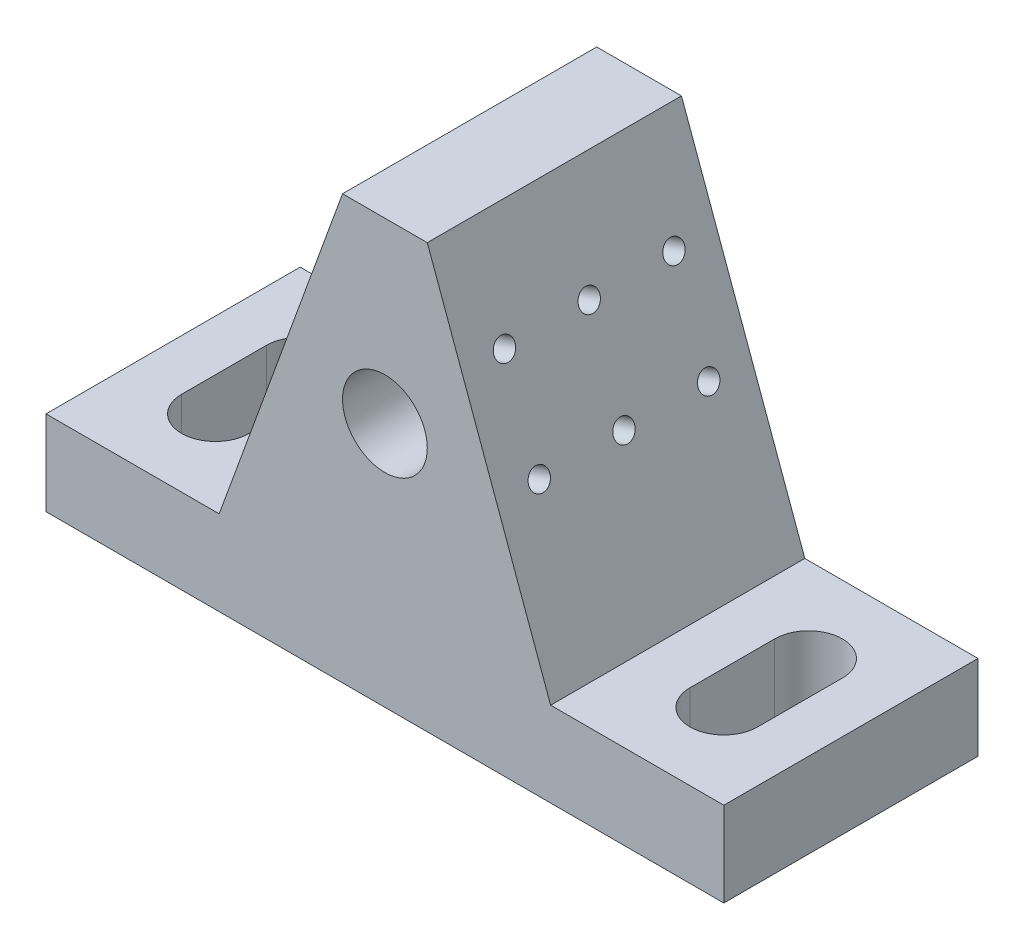
ISO-10303-21;
HEADER;
FILE_DESCRIPTION(('STEP AP214'),'2;1');
FILE_NAME('part.step','',(''),(''),'','','');
FILE_SCHEMA(('AUTOMOTIVE_DESIGN { 1 0 10303 214 1 1 1 1 }'));
ENDSEC;
DATA;
#1=APPLICATION_CONTEXT('core data for automotive mechanical design processes');
#2=APPLICATION_PROTOCOL_DEFINITION('international standard','automotive_design',2000,#1);
#3=PRODUCT_CONTEXT('',#1,'mechanical');
#4=PRODUCT('Part','Part','',(#3));
#5=PRODUCT_RELATED_PRODUCT_CATEGORY('part','',(#4));
#6=PRODUCT_DEFINITION_FORMATION('','',#4);
#7=PRODUCT_DEFINITION_CONTEXT('part definition',#1,'design');
#8=PRODUCT_DEFINITION('design','',#6,#7);
#9=PRODUCT_DEFINITION_SHAPE('','',#8);
#10=(LENGTH_UNIT() NAMED_UNIT(*) SI_UNIT(.MILLI.,.METRE.));
#11=(NAMED_UNIT(*) PLANE_ANGLE_UNIT() SI_UNIT($,.RADIAN.));
#12=(NAMED_UNIT(*) SI_UNIT($,.STERADIAN.) SOLID_ANGLE_UNIT());
#13=UNCERTAINTY_MEASURE_WITH_UNIT(LENGTH_MEASURE(1.E-05),#10,'distance_accuracy_value','');
#14=(GEOMETRIC_REPRESENTATION_CONTEXT(3) GLOBAL_UNCERTAINTY_ASSIGNED_CONTEXT((#13)) GLOBAL_UNIT_ASSIGNED_CONTEXT((#10,
#11,#12)) REPRESENTATION_CONTEXT('',''));
#15=CARTESIAN_POINT('',(0.,0.,0.));
#16=DIRECTION('',(0.,0.,1.));
#17=DIRECTION('',(1.,0.,0.));
#18=AXIS2_PLACEMENT_3D('',#15,#16,#17);
#19=CARTESIAN_POINT('',(9.11226014955212,38.7016580961826,-10.));
#20=DIRECTION('',(0.939692620785907,0.342020143325673,0.));
#21=DIRECTION('',(-0.342020143325673,0.939692620785907,0.));
#22=AXIS2_PLACEMENT_3D('',#19,#20,#21);
#23=CYLINDRICAL_SURFACE('',#22,1.24999999999999);
#24=CARTESIAN_POINT('',(2.06456549365783,36.13650702124,-10.));
#25=DIRECTION('',(0.939692620785907,0.342020143325673,0.));
#26=DIRECTION('',(-0.342020143325673,0.939692620785907,0.));
#27=AXIS2_PLACEMENT_3D('',#24,#25,#26);
#28=CIRCLE('',#27,1.24999999999999);
#29=CARTESIAN_POINT('',(1.63704031450074,37.3111227972224,-10.));
#30=VERTEX_POINT('',#29);
#31=EDGE_CURVE('E11',#30,#30,#28,.T.);
#32=ORIENTED_EDGE('',*,*,#31,.F.);
#33=EDGE_LOOP('',(#32));
#34=FACE_BOUND('',#33,.T.);
#35=CARTESIAN_POINT('',(9.11226014955213,38.7016580961826,-10.));
#36=DIRECTION('',(0.939692620785907,0.342020143325673,0.));
#37=DIRECTION('',(-0.342020143325673,0.939692620785907,0.));
#38=AXIS2_PLACEMENT_3D('',#35,#36,#37);
#39=CIRCLE('',#38,1.24999999999999);
#40=CARTESIAN_POINT('',(8.68473497039504,39.876273872165,-10.));
#41=VERTEX_POINT('',#40);
#42=EDGE_CURVE('E50',#41,#41,#39,.T.);
#43=ORIENTED_EDGE('',*,*,#42,.T.);
#44=EDGE_LOOP('',(#43));
#45=FACE_BOUND('',#44,.T.);
#46=ADVANCED_FACE('F43',(#34,#45),#23,.F.);
#47=CARTESIAN_POINT('',(2.06456549365783,36.13650702124,-10.));
#48=DIRECTION('',(0.939692620785907,0.342020143325673,0.));
#49=DIRECTION('',(-0.342020143325673,0.939692620785907,0.));
#50=AXIS2_PLACEMENT_3D('',#47,#48,#49);
#51=CONICAL_SURFACE('',#50,1.24999999999999,1.02974425867665);
#52=CARTESIAN_POINT('',(1.35878513138151,35.8796239774419,-10.));
#53=VERTEX_POINT('',#52);
#54=VERTEX_LOOP('',#53);
#55=FACE_BOUND('',#54,.T.);
#56=ORIENTED_EDGE('',*,*,#31,.T.);
#57=EDGE_LOOP('',(#56));
#58=FACE_BOUND('',#57,.T.);
#59=ADVANCED_FACE('F355',(#55,#58),#51,.F.);
#60=CARTESIAN_POINT('',(9.11226014955212,38.7016580961826,0.));
#61=DIRECTION('',(0.939692620785907,0.342020143325673,0.));
#62=DIRECTION('',(-0.342020143325673,0.939692620785907,0.));
#63=AXIS2_PLACEMENT_3D('',#60,#61,#62);
#64=CYLINDRICAL_SURFACE('',#63,1.24999999999999);
#65=CARTESIAN_POINT('',(2.06456549365783,36.13650702124,0.));
#66=DIRECTION('',(0.939692620785907,0.342020143325673,0.));
#67=DIRECTION('',(-0.342020143325673,0.939692620785907,0.));
#68=AXIS2_PLACEMENT_3D('',#65,#66,#67);
#69=CIRCLE('',#68,1.24999999999999);
#70=CARTESIAN_POINT('',(1.63704031450074,37.3111227972224,0.));
#71=VERTEX_POINT('',#70);
#72=EDGE_CURVE('E328',#71,#71,#69,.T.);
#73=ORIENTED_EDGE('',*,*,#72,.F.);
#74=EDGE_LOOP('',(#73));
#75=FACE_BOUND('',#74,.T.);
#76=CARTESIAN_POINT('',(9.11226014955213,38.7016580961826,0.));
#77=DIRECTION('',(0.939692620785907,0.342020143325673,0.));
#78=DIRECTION('',(-0.342020143325673,0.939692620785907,0.));
#79=AXIS2_PLACEMENT_3D('',#76,#77,#78);
#80=CIRCLE('',#79,1.24999999999999);
#81=CARTESIAN_POINT('',(8.68473497039504,39.876273872165,0.));
#82=VERTEX_POINT('',#81);
#83=EDGE_CURVE('E325',#82,#82,#80,.T.);
#84=ORIENTED_EDGE('',*,*,#83,.T.);
#85=EDGE_LOOP('',(#84));
#86=FACE_BOUND('',#85,.T.);
#87=ADVANCED_FACE('F361',(#75,#86),#64,.F.);
#88=CARTESIAN_POINT('',(2.06456549365783,36.13650702124,0.));
#89=DIRECTION('',(0.939692620785907,0.342020143325673,0.));
#90=DIRECTION('',(-0.342020143325673,0.939692620785907,0.));
#91=AXIS2_PLACEMENT_3D('',#88,#89,#90);
#92=CONICAL_SURFACE('',#91,1.24999999999999,1.02974425867665);
#93=CARTESIAN_POINT('',(1.35878513138151,35.8796239774419,0.));
#94=VERTEX_POINT('',#93);
#95=VERTEX_LOOP('',#94);
#96=FACE_BOUND('',#95,.T.);
#97=ORIENTED_EDGE('',*,*,#72,.T.);
#98=EDGE_LOOP('',(#97));
#99=FACE_BOUND('',#98,.T.);
#100=ADVANCED_FACE('F367',(#96,#99),#92,.F.);
#101=CARTESIAN_POINT('',(9.11226014955212,38.7016580961826,10.));
#102=DIRECTION('',(0.939692620785907,0.342020143325673,0.));
#103=DIRECTION('',(-0.342020143325673,0.939692620785907,0.));
#104=AXIS2_PLACEMENT_3D('',#101,#102,#103);
#105=CYLINDRICAL_SURFACE('',#104,1.24999999999999);
#106=CARTESIAN_POINT('',(2.06456549365783,36.13650702124,10.));
#107=DIRECTION('',(0.939692620785907,0.342020143325673,0.));
#108=DIRECTION('',(-0.342020143325673,0.939692620785907,0.));
#109=AXIS2_PLACEMENT_3D('',#106,#107,#108);
#110=CIRCLE('',#109,1.24999999999999);
#111=CARTESIAN_POINT('',(1.63704031450074,37.3111227972224,10.));
#112=VERTEX_POINT('',#111);
#113=EDGE_CURVE('E322',#112,#112,#110,.T.);
#114=ORIENTED_EDGE('',*,*,#113,.F.);
#115=EDGE_LOOP('',(#114));
#116=FACE_BOUND('',#115,.T.);
#117=CARTESIAN_POINT('',(9.11226014955213,38.7016580961826,10.));
#118=DIRECTION('',(0.939692620785907,0.342020143325673,0.));
#119=DIRECTION('',(-0.342020143325673,0.939692620785907,0.));
#120=AXIS2_PLACEMENT_3D('',#117,#118,#119);
#121=CIRCLE('',#120,1.24999999999999);
#122=CARTESIAN_POINT('',(8.68473497039504,39.876273872165,10.));
#123=VERTEX_POINT('',#122);
#124=EDGE_CURVE('E319',#123,#123,#121,.T.);
#125=ORIENTED_EDGE('',*,*,#124,.T.);
#126=EDGE_LOOP('',(#125));
#127=FACE_BOUND('',#126,.T.);
#128=ADVANCED_FACE('F373',(#116,#127),#105,.F.);
#129=CARTESIAN_POINT('',(2.06456549365783,36.13650702124,10.));
#130=DIRECTION('',(0.939692620785907,0.342020143325673,0.));
#131=DIRECTION('',(-0.342020143325673,0.939692620785907,0.));
#132=AXIS2_PLACEMENT_3D('',#129,#130,#131);
#133=CONICAL_SURFACE('',#132,1.24999999999999,1.02974425867665);
#134=CARTESIAN_POINT('',(1.35878513138151,35.8796239774419,10.));
#135=VERTEX_POINT('',#134);
#136=VERTEX_LOOP('',#135);
#137=FACE_BOUND('',#136,.T.);
#138=ORIENTED_EDGE('',*,*,#113,.T.);
#139=EDGE_LOOP('',(#138));
#140=FACE_BOUND('',#139,.T.);
#141=ADVANCED_FACE('F376',(#137,#140),#133,.F.);
#142=CARTESIAN_POINT('',(13.2165018694602,27.4253466467517,-10.));
#143=DIRECTION('',(0.939692620785907,0.342020143325673,0.));
#144=DIRECTION('',(-0.342020143325673,0.939692620785907,0.));
#145=AXIS2_PLACEMENT_3D('',#142,#143,#144);
#146=CYLINDRICAL_SURFACE('',#145,1.24999999999999);
#147=CARTESIAN_POINT('',(6.16880721356591,24.8601955718092,-10.));
#148=DIRECTION('',(0.939692620785907,0.342020143325673,0.));
#149=DIRECTION('',(-0.342020143325673,0.939692620785907,0.));
#150=AXIS2_PLACEMENT_3D('',#147,#148,#149);
#151=CIRCLE('',#150,1.24999999999999);
#152=CARTESIAN_POINT('',(5.74128203440882,26.0348113477915,-10.));
#153=VERTEX_POINT('',#152);
#154=EDGE_CURVE('E316',#153,#153,#151,.T.);
#155=ORIENTED_EDGE('',*,*,#154,.F.);
#156=EDGE_LOOP('',(#155));
#157=FACE_BOUND('',#156,.T.);
#158=CARTESIAN_POINT('',(13.2165018694602,27.4253466467517,-10.));
#159=DIRECTION('',(0.939692620785907,0.342020143325673,0.));
#160=DIRECTION('',(-0.342020143325673,0.939692620785907,0.));
#161=AXIS2_PLACEMENT_3D('',#158,#159,#160);
#162=CIRCLE('',#161,1.24999999999999);
#163=CARTESIAN_POINT('',(12.7889766903031,28.5999624227341,-10.));
#164=VERTEX_POINT('',#163);
#165=EDGE_CURVE('E313',#164,#164,#162,.T.);
#166=ORIENTED_EDGE('',*,*,#165,.T.);
#167=EDGE_LOOP('',(#166));
#168=FACE_BOUND('',#167,.T.);
#169=ADVANCED_FACE('F380',(#157,#168),#146,.F.);
#170=CARTESIAN_POINT('',(6.16880721356591,24.8601955718092,-10.));
#171=DIRECTION('',(0.939692620785907,0.342020143325673,0.));
#172=DIRECTION('',(-0.342020143325673,0.939692620785907,0.));
#173=AXIS2_PLACEMENT_3D('',#170,#171,#172);
#174=CONICAL_SURFACE('',#173,1.24999999999999,1.02974425867665);
#175=CARTESIAN_POINT('',(5.46302685128959,24.603312528011,-10.));
#176=VERTEX_POINT('',#175);
#177=VERTEX_LOOP('',#176);
#178=FACE_BOUND('',#177,.T.);
#179=ORIENTED_EDGE('',*,*,#154,.T.);
#180=EDGE_LOOP('',(#179));
#181=FACE_BOUND('',#180,.T.);
#182=ADVANCED_FACE('F384',(#178,#181),#174,.F.);
#183=CARTESIAN_POINT('',(-40.,0.,15.));
#184=DIRECTION('',(0.,1.,0.));
#185=DIRECTION('',(0.,0.,1.));
#186=AXIS2_PLACEMENT_3D('',#183,#184,#185);
#187=PLANE('',#186);
#188=DIRECTION('',(1.,0.,0.));
#189=VECTOR('',#188,1.);
#190=CARTESIAN_POINT('',(-40.,0.,-15.));
#191=LINE('',#190,#189);
#192=CARTESIAN_POINT('',(-40.,0.,-15.));
#193=VERTEX_POINT('',#192);
#194=CARTESIAN_POINT('',(40.,0.,-15.));
#195=VERTEX_POINT('',#194);
#196=EDGE_CURVE('E277',#193,#195,#191,.T.);
#197=ORIENTED_EDGE('',*,*,#196,.T.);
#198=DIRECTION('',(0.,0.,-1.));
#199=VECTOR('',#198,1.);
#200=CARTESIAN_POINT('',(40.,0.,15.));
#201=LINE('',#200,#199);
#202=CARTESIAN_POINT('',(40.,0.,15.));
#203=VERTEX_POINT('',#202);
#204=EDGE_CURVE('E307',#203,#195,#201,.T.);
#205=ORIENTED_EDGE('',*,*,#204,.F.);
#206=DIRECTION('',(1.,0.,0.));
#207=VECTOR('',#206,1.);
#208=CARTESIAN_POINT('',(-40.,0.,15.));
#209=LINE('',#208,#207);
#210=CARTESIAN_POINT('',(-40.,0.,15.));
#211=VERTEX_POINT('',#210);
#212=EDGE_CURVE('E259',#211,#203,#209,.T.);
#213=ORIENTED_EDGE('',*,*,#212,.F.);
#214=DIRECTION('',(0.,0.,-1.));
#215=VECTOR('',#214,1.);
#216=CARTESIAN_POINT('',(-40.,0.,15.));
#217=LINE('',#216,#215);
#218=EDGE_CURVE('E310',#211,#193,#217,.T.);
#219=ORIENTED_EDGE('',*,*,#218,.T.);
#220=EDGE_LOOP('',(#197,#205,#213,#219));
#221=FACE_BOUND('',#220,.T.);
#222=DIRECTION('',(0.,0.,1.));
#223=VECTOR('',#222,1.);
#224=CARTESIAN_POINT('',(26.,0.,5.));
#225=LINE('',#224,#223);
#226=CARTESIAN_POINT('',(26.,0.,-5.));
#227=VERTEX_POINT('',#226);
#228=CARTESIAN_POINT('',(26.,0.,5.));
#229=VERTEX_POINT('',#228);
#230=EDGE_CURVE('E234',#227,#229,#225,.T.);
#231=ORIENTED_EDGE('',*,*,#230,.T.);
#232=CARTESIAN_POINT('',(30.,0.,5.));
#233=DIRECTION('',(0.,1.,0.));
#234=DIRECTION('',(-1.,0.,0.));
#235=AXIS2_PLACEMENT_3D('',#232,#233,#234);
#236=CIRCLE('',#235,4.);
#237=CARTESIAN_POINT('',(34.,0.,5.));
#238=VERTEX_POINT('',#237);
#239=EDGE_CURVE('E224',#229,#238,#236,.T.);
#240=ORIENTED_EDGE('',*,*,#239,.T.);
#241=DIRECTION('',(0.,0.,-1.));
#242=VECTOR('',#241,1.);
#243=CARTESIAN_POINT('',(34.,0.,5.));
#244=LINE('',#243,#242);
#245=CARTESIAN_POINT('',(34.,0.,-5.));
#246=VERTEX_POINT('',#245);
#247=EDGE_CURVE('E227',#238,#246,#244,.T.);
#248=ORIENTED_EDGE('',*,*,#247,.T.);
#249=CARTESIAN_POINT('',(30.,0.,-5.));
#250=DIRECTION('',(0.,1.,0.));
#251=DIRECTION('',(-1.,0.,0.));
#252=AXIS2_PLACEMENT_3D('',#249,#250,#251);
#253=CIRCLE('',#252,4.);
#254=EDGE_CURVE('E231',#246,#227,#253,.T.);
#255=ORIENTED_EDGE('',*,*,#254,.T.);
#256=EDGE_LOOP('',(#231,#240,#248,#255));
#257=FACE_BOUND('',#256,.T.);
#258=CARTESIAN_POINT('',(-30.,0.,5.));
#259=DIRECTION('',(0.,-1.,0.));
#260=DIRECTION('',(1.,0.,0.));
#261=AXIS2_PLACEMENT_3D('',#258,#259,#260);
#262=CIRCLE('',#261,4.);
#263=CARTESIAN_POINT('',(-26.,0.,5.));
#264=VERTEX_POINT('',#263);
#265=CARTESIAN_POINT('',(-34.,0.,5.));
#266=VERTEX_POINT('',#265);
#267=EDGE_CURVE('E193',#264,#266,#262,.T.);
#268=ORIENTED_EDGE('',*,*,#267,.F.);
#269=DIRECTION('',(0.,0.,1.));
#270=VECTOR('',#269,1.);
#271=CARTESIAN_POINT('',(-26.,0.,5.));
#272=LINE('',#271,#270);
#273=CARTESIAN_POINT('',(-26.,0.,-5.));
#274=VERTEX_POINT('',#273);
#275=EDGE_CURVE('E195',#274,#264,#272,.T.);
#276=ORIENTED_EDGE('',*,*,#275,.F.);
#277=CARTESIAN_POINT('',(-30.,0.,-5.));
#278=DIRECTION('',(0.,-1.,0.));
#279=DIRECTION('',(1.,0.,0.));
#280=AXIS2_PLACEMENT_3D('',#277,#278,#279);
#281=CIRCLE('',#280,4.);
#282=CARTESIAN_POINT('',(-34.,0.,-5.));
#283=VERTEX_POINT('',#282);
#284=EDGE_CURVE('E198',#283,#274,#281,.T.);
#285=ORIENTED_EDGE('',*,*,#284,.F.);
#286=DIRECTION('',(0.,0.,-1.));
#287=VECTOR('',#286,1.);
#288=CARTESIAN_POINT('',(-34.,0.,5.));
#289=LINE('',#288,#287);
#290=EDGE_CURVE('E201',#266,#283,#289,.T.);
#291=ORIENTED_EDGE('',*,*,#290,.F.);
#292=EDGE_LOOP('',(#268,#276,#285,#291));
#293=FACE_BOUND('',#292,.T.);
#294=ADVANCED_FACE('F388',(#221,#257,#293),#187,.F.);
#295=CARTESIAN_POINT('',(-40.,10.,15.));
#296=DIRECTION('',(0.,-1.,0.));
#297=DIRECTION('',(1.,0.,0.));
#298=AXIS2_PLACEMENT_3D('',#295,#296,#297);
#299=PLANE('',#298);
#300=DIRECTION('',(-1.,0.,0.));
#301=VECTOR('',#300,1.);
#302=CARTESIAN_POINT('',(-40.,10.,-15.));
#303=LINE('',#302,#301);
#304=CARTESIAN_POINT('',(-19.5588093706483,10.,-15.));
#305=VERTEX_POINT('',#304);
#306=CARTESIAN_POINT('',(-40.,10.,-15.));
#307=VERTEX_POINT('',#306);
#308=EDGE_CURVE('E260',#305,#307,#303,.T.);
#309=ORIENTED_EDGE('',*,*,#308,.T.);
#310=DIRECTION('',(0.,0.,-1.));
#311=VECTOR('',#310,1.);
#312=CARTESIAN_POINT('',(-40.,10.,15.));
#313=LINE('',#312,#311);
#314=CARTESIAN_POINT('',(-40.,10.,15.));
#315=VERTEX_POINT('',#314);
#316=EDGE_CURVE('E274',#315,#307,#313,.T.);
#317=ORIENTED_EDGE('',*,*,#316,.F.);
#318=DIRECTION('',(-1.,0.,0.));
#319=VECTOR('',#318,1.);
#320=CARTESIAN_POINT('',(-40.,10.,15.));
#321=LINE('',#320,#319);
#322=CARTESIAN_POINT('',(-19.5588093706483,10.,15.));
#323=VERTEX_POINT('',#322);
#324=EDGE_CURVE('E272',#323,#315,#321,.T.);
#325=ORIENTED_EDGE('',*,*,#324,.F.);
#326=DIRECTION('',(0.,0.,-1.));
#327=VECTOR('',#326,1.);
#328=CARTESIAN_POINT('',(-19.5588093706483,10.,15.));
#329=LINE('',#328,#327);
#330=EDGE_CURVE('E292',#323,#305,#329,.T.);
#331=ORIENTED_EDGE('',*,*,#330,.T.);
#332=EDGE_LOOP('',(#309,#317,#325,#331));
#333=FACE_BOUND('',#332,.T.);
#334=CARTESIAN_POINT('',(-30.,10.,5.));
#335=DIRECTION('',(0.,-1.,0.));
#336=DIRECTION('',(1.,0.,0.));
#337=AXIS2_PLACEMENT_3D('',#334,#335,#336);
#338=CIRCLE('',#337,4.);
#339=CARTESIAN_POINT('',(-26.,10.,5.));
#340=VERTEX_POINT('',#339);
#341=CARTESIAN_POINT('',(-34.,10.,5.));
#342=VERTEX_POINT('',#341);
#343=EDGE_CURVE('E190',#340,#342,#338,.T.);
#344=ORIENTED_EDGE('',*,*,#343,.T.);
#345=DIRECTION('',(0.,0.,-1.));
#346=VECTOR('',#345,1.);
#347=CARTESIAN_POINT('',(-34.,10.,5.));
#348=LINE('',#347,#346);
#349=CARTESIAN_POINT('',(-34.,10.,-5.));
#350=VERTEX_POINT('',#349);
#351=EDGE_CURVE('E196',#342,#350,#348,.T.);
#352=ORIENTED_EDGE('',*,*,#351,.T.);
#353=CARTESIAN_POINT('',(-30.,10.,-5.));
#354=DIRECTION('',(0.,-1.,0.));
#355=DIRECTION('',(1.,0.,0.));
#356=AXIS2_PLACEMENT_3D('',#353,#354,#355);
#357=CIRCLE('',#356,4.);
#358=CARTESIAN_POINT('',(-26.,10.,-5.));
#359=VERTEX_POINT('',#358);
#360=EDGE_CURVE('E209',#350,#359,#357,.T.);
#361=ORIENTED_EDGE('',*,*,#360,.T.);
#362=DIRECTION('',(0.,0.,1.));
#363=VECTOR('',#362,1.);
#364=CARTESIAN_POINT('',(-26.,10.,5.));
#365=LINE('',#364,#363);
#366=EDGE_CURVE('E206',#359,#340,#365,.T.);
#367=ORIENTED_EDGE('',*,*,#366,.T.);
#368=EDGE_LOOP('',(#344,#352,#361,#367));
#369=FACE_BOUND('',#368,.T.);
#370=ADVANCED_FACE('F393',(#333,#369),#299,.F.);
#371=CARTESIAN_POINT('',(-40.,0.,15.));
#372=DIRECTION('',(1.,0.,0.));
#373=DIRECTION('',(0.,0.,-1.));
#374=AXIS2_PLACEMENT_3D('',#371,#372,#373);
#375=PLANE('',#374);
#376=DIRECTION('',(0.,-1.,0.));
#377=VECTOR('',#376,1.);
#378=CARTESIAN_POINT('',(-40.,0.,-15.));
#379=LINE('',#378,#377);
#380=EDGE_CURVE('E249',#307,#193,#379,.T.);
#381=ORIENTED_EDGE('',*,*,#380,.T.);
#382=ORIENTED_EDGE('',*,*,#218,.F.);
#383=DIRECTION('',(0.,-1.,0.));
#384=VECTOR('',#383,1.);
#385=CARTESIAN_POINT('',(-40.,0.,15.));
#386=LINE('',#385,#384);
#387=EDGE_CURVE('E256',#315,#211,#386,.T.);
#388=ORIENTED_EDGE('',*,*,#387,.F.);
#389=ORIENTED_EDGE('',*,*,#316,.T.);
#390=EDGE_LOOP('',(#381,#382,#388,#389));
#391=FACE_BOUND('',#390,.T.);
#392=ADVANCED_FACE('F390',(#391),#375,.F.);
#393=CARTESIAN_POINT('',(40.,0.,15.));
#394=DIRECTION('',(-1.,0.,0.));
#395=DIRECTION('',(0.,0.,1.));
#396=AXIS2_PLACEMENT_3D('',#393,#394,#395);
#397=PLANE('',#396);
#398=DIRECTION('',(0.,1.,0.));
#399=VECTOR('',#398,1.);
#400=CARTESIAN_POINT('',(40.,0.,-15.));
#401=LINE('',#400,#399);
#402=CARTESIAN_POINT('',(40.,10.,-15.));
#403=VERTEX_POINT('',#402);
#404=EDGE_CURVE('E279',#195,#403,#401,.T.);
#405=ORIENTED_EDGE('',*,*,#404,.T.);
#406=DIRECTION('',(0.,0.,-1.));
#407=VECTOR('',#406,1.);
#408=CARTESIAN_POINT('',(40.,10.,15.));
#409=LINE('',#408,#407);
#410=CARTESIAN_POINT('',(40.,10.,15.));
#411=VERTEX_POINT('',#410);
#412=EDGE_CURVE('E304',#411,#403,#409,.T.);
#413=ORIENTED_EDGE('',*,*,#412,.F.);
#414=DIRECTION('',(0.,1.,0.));
#415=VECTOR('',#414,1.);
#416=CARTESIAN_POINT('',(40.,0.,15.));
#417=LINE('',#416,#415);
#418=EDGE_CURVE('E262',#203,#411,#417,.T.);
#419=ORIENTED_EDGE('',*,*,#418,.F.);
#420=ORIENTED_EDGE('',*,*,#204,.T.);
#421=EDGE_LOOP('',(#405,#413,#419,#420));
#422=FACE_BOUND('',#421,.T.);
#423=ADVANCED_FACE('F349',(#422),#397,.F.);
#424=CARTESIAN_POINT('',(40.,10.,15.));
#425=DIRECTION('',(0.,-1.,0.));
#426=DIRECTION('',(1.,0.,0.));
#427=AXIS2_PLACEMENT_3D('',#424,#425,#426);
#428=PLANE('',#427);
#429=DIRECTION('',(0.,0.,-1.));
#430=VECTOR('',#429,1.);
#431=CARTESIAN_POINT('',(34.,10.,5.));
#432=LINE('',#431,#430);
#433=CARTESIAN_POINT('',(34.,10.,5.));
#434=VERTEX_POINT('',#433);
#435=CARTESIAN_POINT('',(34.,10.,-5.));
#436=VERTEX_POINT('',#435);
#437=EDGE_CURVE('E239',#434,#436,#432,.T.);
#438=ORIENTED_EDGE('',*,*,#437,.F.);
#439=CARTESIAN_POINT('',(30.,10.,5.));
#440=DIRECTION('',(0.,1.,0.));
#441=DIRECTION('',(-1.,0.,0.));
#442=AXIS2_PLACEMENT_3D('',#439,#440,#441);
#443=CIRCLE('',#442,4.);
#444=CARTESIAN_POINT('',(26.,10.,5.));
#445=VERTEX_POINT('',#444);
#446=EDGE_CURVE('E217',#445,#434,#443,.T.);
#447=ORIENTED_EDGE('',*,*,#446,.F.);
#448=DIRECTION('',(0.,0.,1.));
#449=VECTOR('',#448,1.);
#450=CARTESIAN_POINT('',(26.,10.,5.));
#451=LINE('',#450,#449);
#452=CARTESIAN_POINT('',(26.,10.,-5.));
#453=VERTEX_POINT('',#452);
#454=EDGE_CURVE('E228',#453,#445,#451,.T.);
#455=ORIENTED_EDGE('',*,*,#454,.F.);
#456=CARTESIAN_POINT('',(30.,10.,-5.));
#457=DIRECTION('',(0.,1.,0.));
#458=DIRECTION('',(-1.,0.,0.));
#459=AXIS2_PLACEMENT_3D('',#456,#457,#458);
#460=CIRCLE('',#459,4.);
#461=EDGE_CURVE('E242',#436,#453,#460,.T.);
#462=ORIENTED_EDGE('',*,*,#461,.F.);
#463=EDGE_LOOP('',(#438,#447,#455,#462));
#464=FACE_BOUND('',#463,.T.);
#465=DIRECTION('',(-1.,0.,0.));
#466=VECTOR('',#465,1.);
#467=CARTESIAN_POINT('',(40.,10.,-15.));
#468=LINE('',#467,#466);
#469=CARTESIAN_POINT('',(19.5588093706483,10.,-15.));
#470=VERTEX_POINT('',#469);
#471=EDGE_CURVE('E281',#403,#470,#468,.T.);
#472=ORIENTED_EDGE('',*,*,#471,.T.);
#473=DIRECTION('',(0.,0.,-1.));
#474=VECTOR('',#473,1.);
#475=CARTESIAN_POINT('',(19.5588093706483,10.,15.));
#476=LINE('',#475,#474);
#477=CARTESIAN_POINT('',(19.5588093706483,10.,15.));
#478=VERTEX_POINT('',#477);
#479=EDGE_CURVE('E301',#478,#470,#476,.T.);
#480=ORIENTED_EDGE('',*,*,#479,.F.);
#481=DIRECTION('',(-1.,0.,0.));
#482=VECTOR('',#481,1.);
#483=CARTESIAN_POINT('',(40.,10.,15.));
#484=LINE('',#483,#482);
#485=EDGE_CURVE('E264',#411,#478,#484,.T.);
#486=ORIENTED_EDGE('',*,*,#485,.F.);
#487=ORIENTED_EDGE('',*,*,#412,.T.);
#488=EDGE_LOOP('',(#472,#480,#486,#487));
#489=FACE_BOUND('',#488,.T.);
#490=ADVANCED_FACE('F337',(#464,#489),#428,.F.);
#491=CARTESIAN_POINT('',(19.5588093706483,10.,15.));
#492=DIRECTION('',(-0.939692620785907,-0.342020143325673,0.));
#493=DIRECTION('',(0.342020143325673,-0.939692620785907,0.));
#494=AXIS2_PLACEMENT_3D('',#491,#492,#493);
#495=PLANE('',#494);
#496=CARTESIAN_POINT('',(13.2165018694602,27.4253466467517,0.));
#497=DIRECTION('',(0.939692620785907,0.342020143325673,0.));
#498=DIRECTION('',(-0.342020143325673,0.939692620785907,0.));
#499=AXIS2_PLACEMENT_3D('',#496,#497,#498);
#500=CIRCLE('',#499,1.24999999999999);
#501=CARTESIAN_POINT('',(12.7889766903031,28.5999624227341,0.));
#502=VERTEX_POINT('',#501);
#503=EDGE_CURVE('E176',#502,#502,#500,.T.);
#504=ORIENTED_EDGE('',*,*,#503,.F.);
#505=EDGE_LOOP('',(#504));
#506=FACE_BOUND('',#505,.T.);
#507=CARTESIAN_POINT('',(13.2165018694602,27.4253466467517,10.));
#508=DIRECTION('',(0.939692620785907,0.342020143325673,0.));
#509=DIRECTION('',(-0.342020143325673,0.939692620785907,0.));
#510=AXIS2_PLACEMENT_3D('',#507,#508,#509);
#511=CIRCLE('',#510,1.24999999999999);
#512=CARTESIAN_POINT('',(12.7889766903031,28.5999624227341,10.));
#513=VERTEX_POINT('',#512);
#514=EDGE_CURVE('E175',#513,#513,#511,.T.);
#515=ORIENTED_EDGE('',*,*,#514,.F.);
#516=EDGE_LOOP('',(#515));
#517=FACE_BOUND('',#516,.T.);
#518=DIRECTION('',(-0.342020143325673,0.939692620785907,0.));
#519=VECTOR('',#518,1.);
#520=CARTESIAN_POINT('',(19.5588093706483,10.,-15.));
#521=LINE('',#520,#519);
#522=CARTESIAN_POINT('',(5.,50.,-15.));
#523=VERTEX_POINT('',#522);
#524=EDGE_CURVE('E283',#470,#523,#521,.T.);
#525=ORIENTED_EDGE('',*,*,#524,.T.);
#526=DIRECTION('',(0.,0.,-1.));
#527=VECTOR('',#526,1.);
#528=CARTESIAN_POINT('',(5.,50.,15.));
#529=LINE('',#528,#527);
#530=CARTESIAN_POINT('',(5.,50.,15.));
#531=VERTEX_POINT('',#530);
#532=EDGE_CURVE('E298',#531,#523,#529,.T.);
#533=ORIENTED_EDGE('',*,*,#532,.F.);
#534=DIRECTION('',(-0.342020143325673,0.939692620785907,0.));
#535=VECTOR('',#534,1.);
#536=CARTESIAN_POINT('',(19.5588093706483,10.,15.));
#537=LINE('',#536,#535);
#538=EDGE_CURVE('E266',#478,#531,#537,.T.);
#539=ORIENTED_EDGE('',*,*,#538,.F.);
#540=ORIENTED_EDGE('',*,*,#479,.T.);
#541=EDGE_LOOP('',(#525,#533,#539,#540));
#542=FACE_BOUND('',#541,.T.);
#543=ORIENTED_EDGE('',*,*,#165,.F.);
#544=EDGE_LOOP('',(#543));
#545=FACE_BOUND('',#544,.T.);
#546=ORIENTED_EDGE('',*,*,#124,.F.);
#547=EDGE_LOOP('',(#546));
#548=FACE_BOUND('',#547,.T.);
#549=ORIENTED_EDGE('',*,*,#83,.F.);
#550=EDGE_LOOP('',(#549));
#551=FACE_BOUND('',#550,.T.);
#552=ORIENTED_EDGE('',*,*,#42,.F.);
#553=EDGE_LOOP('',(#552));
#554=FACE_BOUND('',#553,.T.);
#555=ADVANCED_FACE('F334',(#506,#517,#542,#545,#548,#551,#554),#495,.F.);
#556=CARTESIAN_POINT('',(5.,50.,15.));
#557=DIRECTION('',(0.,-1.,0.));
#558=DIRECTION('',(0.,0.,-1.));
#559=AXIS2_PLACEMENT_3D('',#556,#557,#558);
#560=PLANE('',#559);
#561=DIRECTION('',(-1.,0.,0.));
#562=VECTOR('',#561,1.);
#563=CARTESIAN_POINT('',(5.,50.,-15.));
#564=LINE('',#563,#562);
#565=CARTESIAN_POINT('',(-5.,50.,-15.));
#566=VERTEX_POINT('',#565);
#567=EDGE_CURVE('E285',#523,#566,#564,.T.);
#568=ORIENTED_EDGE('',*,*,#567,.T.);
#569=DIRECTION('',(0.,0.,-1.));
#570=VECTOR('',#569,1.);
#571=CARTESIAN_POINT('',(-5.,50.,15.));
#572=LINE('',#571,#570);
#573=CARTESIAN_POINT('',(-5.,50.,15.));
#574=VERTEX_POINT('',#573);
#575=EDGE_CURVE('E295',#574,#566,#572,.T.);
#576=ORIENTED_EDGE('',*,*,#575,.F.);
#577=DIRECTION('',(-1.,0.,0.));
#578=VECTOR('',#577,1.);
#579=CARTESIAN_POINT('',(5.,50.,15.));
#580=LINE('',#579,#578);
#581=EDGE_CURVE('E268',#531,#574,#580,.T.);
#582=ORIENTED_EDGE('',*,*,#581,.F.);
#583=ORIENTED_EDGE('',*,*,#532,.T.);
#584=EDGE_LOOP('',(#568,#576,#582,#583));
#585=FACE_BOUND('',#584,.T.);
#586=ADVANCED_FACE('F336',(#585),#560,.F.);
#587=CARTESIAN_POINT('',(-19.5588093706483,10.,15.));
#588=DIRECTION('',(0.939692620785907,-0.342020143325673,0.));
#589=DIRECTION('',(0.342020143325673,0.939692620785907,0.));
#590=AXIS2_PLACEMENT_3D('',#587,#588,#589);
#591=PLANE('',#590);
#592=DIRECTION('',(-0.342020143325673,-0.939692620785907,0.));
#593=VECTOR('',#592,1.);
#594=CARTESIAN_POINT('',(-19.5588093706483,10.,-15.));
#595=LINE('',#594,#593);
#596=EDGE_CURVE('E287',#566,#305,#595,.T.);
#597=ORIENTED_EDGE('',*,*,#596,.T.);
#598=ORIENTED_EDGE('',*,*,#330,.F.);
#599=DIRECTION('',(-0.342020143325673,-0.939692620785907,0.));
#600=VECTOR('',#599,1.);
#601=CARTESIAN_POINT('',(-19.5588093706483,10.,15.));
#602=LINE('',#601,#600);
#603=EDGE_CURVE('E270',#574,#323,#602,.T.);
#604=ORIENTED_EDGE('',*,*,#603,.F.);
#605=ORIENTED_EDGE('',*,*,#575,.T.);
#606=EDGE_LOOP('',(#597,#598,#604,#605));
#607=FACE_BOUND('',#606,.T.);
#608=ADVANCED_FACE('F345',(#607),#591,.F.);
#609=CARTESIAN_POINT('',(0.,0.,15.));
#610=DIRECTION('',(0.,0.,-1.));
#611=DIRECTION('',(-1.,0.,0.));
#612=AXIS2_PLACEMENT_3D('',#609,#610,#611);
#613=PLANE('',#612);
#614=CARTESIAN_POINT('',(0.,29.,15.));
#615=DIRECTION('',(0.,0.,1.));
#616=DIRECTION('',(1.,0.,0.));
#617=AXIS2_PLACEMENT_3D('',#614,#615,#616);
#618=CIRCLE('',#617,5.);
#619=CARTESIAN_POINT('',(5.,29.,15.));
#620=VERTEX_POINT('',#619);
#621=EDGE_CURVE('E186',#620,#620,#618,.T.);
#622=ORIENTED_EDGE('',*,*,#621,.F.);
#623=EDGE_LOOP('',(#622));
#624=FACE_BOUND('',#623,.T.);
#625=ORIENTED_EDGE('',*,*,#387,.T.);
#626=ORIENTED_EDGE('',*,*,#212,.T.);
#627=ORIENTED_EDGE('',*,*,#418,.T.);
#628=ORIENTED_EDGE('',*,*,#485,.T.);
#629=ORIENTED_EDGE('',*,*,#538,.T.);
#630=ORIENTED_EDGE('',*,*,#581,.T.);
#631=ORIENTED_EDGE('',*,*,#603,.T.);
#632=ORIENTED_EDGE('',*,*,#324,.T.);
#633=EDGE_LOOP('',(#625,#626,#627,#628,#629,#630,#631,#632));
#634=FACE_BOUND('',#633,.T.);
#635=ADVANCED_FACE('F425',(#624,#634),#613,.F.);
#636=CARTESIAN_POINT('',(0.,0.,-15.));
#637=DIRECTION('',(0.,0.,-1.));
#638=DIRECTION('',(-1.,0.,0.));
#639=AXIS2_PLACEMENT_3D('',#636,#637,#638);
#640=PLANE('',#639);
#641=CARTESIAN_POINT('',(0.,29.,-15.));
#642=DIRECTION('',(0.,0.,1.));
#643=DIRECTION('',(1.,0.,0.));
#644=AXIS2_PLACEMENT_3D('',#641,#642,#643);
#645=CIRCLE('',#644,5.);
#646=CARTESIAN_POINT('',(5.,29.,-15.));
#647=VERTEX_POINT('',#646);
#648=EDGE_CURVE('E187',#647,#647,#645,.T.);
#649=ORIENTED_EDGE('',*,*,#648,.T.);
#650=EDGE_LOOP('',(#649));
#651=FACE_BOUND('',#650,.T.);
#652=ORIENTED_EDGE('',*,*,#380,.F.);
#653=ORIENTED_EDGE('',*,*,#308,.F.);
#654=ORIENTED_EDGE('',*,*,#596,.F.);
#655=ORIENTED_EDGE('',*,*,#567,.F.);
#656=ORIENTED_EDGE('',*,*,#524,.F.);
#657=ORIENTED_EDGE('',*,*,#471,.F.);
#658=ORIENTED_EDGE('',*,*,#404,.F.);
#659=ORIENTED_EDGE('',*,*,#196,.F.);
#660=EDGE_LOOP('',(#652,#653,#654,#655,#656,#657,#658,#659));
#661=FACE_BOUND('',#660,.T.);
#662=ADVANCED_FACE('F414',(#651,#661),#640,.T.);
#663=CARTESIAN_POINT('',(30.,0.,5.));
#664=DIRECTION('',(0.,1.,0.));
#665=DIRECTION('',(-1.,0.,0.));
#666=AXIS2_PLACEMENT_3D('',#663,#664,#665);
#667=CYLINDRICAL_SURFACE('',#666,4.);
#668=ORIENTED_EDGE('',*,*,#446,.T.);
#669=DIRECTION('',(0.,1.,0.));
#670=VECTOR('',#669,1.);
#671=CARTESIAN_POINT('',(34.,0.,5.));
#672=LINE('',#671,#670);
#673=EDGE_CURVE('E237',#238,#434,#672,.T.);
#674=ORIENTED_EDGE('',*,*,#673,.F.);
#675=ORIENTED_EDGE('',*,*,#239,.F.);
#676=DIRECTION('',(0.,1.,0.));
#677=VECTOR('',#676,1.);
#678=CARTESIAN_POINT('',(26.,0.,5.));
#679=LINE('',#678,#677);
#680=EDGE_CURVE('E247',#229,#445,#679,.T.);
#681=ORIENTED_EDGE('',*,*,#680,.T.);
#682=EDGE_LOOP('',(#668,#674,#675,#681));
#683=FACE_BOUND('',#682,.T.);
#684=ADVANCED_FACE('F448',(#683),#667,.F.);
#685=CARTESIAN_POINT('',(26.,0.,5.));
#686=DIRECTION('',(-1.,0.,0.));
#687=DIRECTION('',(0.,-1.,0.));
#688=AXIS2_PLACEMENT_3D('',#685,#686,#687);
#689=PLANE('',#688);
#690=ORIENTED_EDGE('',*,*,#454,.T.);
#691=ORIENTED_EDGE('',*,*,#680,.F.);
#692=ORIENTED_EDGE('',*,*,#230,.F.);
#693=DIRECTION('',(0.,1.,0.));
#694=VECTOR('',#693,1.);
#695=CARTESIAN_POINT('',(26.,0.,-5.));
#696=LINE('',#695,#694);
#697=EDGE_CURVE('E250',#227,#453,#696,.T.);
#698=ORIENTED_EDGE('',*,*,#697,.T.);
#699=EDGE_LOOP('',(#690,#691,#692,#698));
#700=FACE_BOUND('',#699,.T.);
#701=ADVANCED_FACE('F453',(#700),#689,.F.);
#702=CARTESIAN_POINT('',(30.,0.,-5.));
#703=DIRECTION('',(0.,1.,0.));
#704=DIRECTION('',(-1.,0.,0.));
#705=AXIS2_PLACEMENT_3D('',#702,#703,#704);
#706=CYLINDRICAL_SURFACE('',#705,4.);
#707=ORIENTED_EDGE('',*,*,#461,.T.);
#708=ORIENTED_EDGE('',*,*,#697,.F.);
#709=ORIENTED_EDGE('',*,*,#254,.F.);
#710=DIRECTION('',(0.,1.,0.));
#711=VECTOR('',#710,1.);
#712=CARTESIAN_POINT('',(34.,0.,-5.));
#713=LINE('',#712,#711);
#714=EDGE_CURVE('E252',#246,#436,#713,.T.);
#715=ORIENTED_EDGE('',*,*,#714,.T.);
#716=EDGE_LOOP('',(#707,#708,#709,#715));
#717=FACE_BOUND('',#716,.T.);
#718=ADVANCED_FACE('F459',(#717),#706,.F.);
#719=CARTESIAN_POINT('',(34.,0.,5.));
#720=DIRECTION('',(1.,0.,0.));
#721=DIRECTION('',(0.,1.,0.));
#722=AXIS2_PLACEMENT_3D('',#719,#720,#721);
#723=PLANE('',#722);
#724=ORIENTED_EDGE('',*,*,#437,.T.);
#725=ORIENTED_EDGE('',*,*,#714,.F.);
#726=ORIENTED_EDGE('',*,*,#247,.F.);
#727=ORIENTED_EDGE('',*,*,#673,.T.);
#728=EDGE_LOOP('',(#724,#725,#726,#727));
#729=FACE_BOUND('',#728,.T.);
#730=ADVANCED_FACE('F455',(#729),#723,.F.);
#731=CARTESIAN_POINT('',(-30.,0.,5.));
#732=DIRECTION('',(0.,1.,0.));
#733=DIRECTION('',(-1.,0.,0.));
#734=AXIS2_PLACEMENT_3D('',#731,#732,#733);
#735=CYLINDRICAL_SURFACE('',#734,4.);
#736=ORIENTED_EDGE('',*,*,#343,.F.);
#737=DIRECTION('',(0.,1.,0.));
#738=VECTOR('',#737,1.);
#739=CARTESIAN_POINT('',(-26.,0.,5.));
#740=LINE('',#739,#738);
#741=EDGE_CURVE('E203',#264,#340,#740,.T.);
#742=ORIENTED_EDGE('',*,*,#741,.F.);
#743=ORIENTED_EDGE('',*,*,#267,.T.);
#744=DIRECTION('',(0.,1.,0.));
#745=VECTOR('',#744,1.);
#746=CARTESIAN_POINT('',(-34.,0.,5.));
#747=LINE('',#746,#745);
#748=EDGE_CURVE('E214',#266,#342,#747,.T.);
#749=ORIENTED_EDGE('',*,*,#748,.T.);
#750=EDGE_LOOP('',(#736,#742,#743,#749));
#751=FACE_BOUND('',#750,.T.);
#752=ADVANCED_FACE('F458',(#751),#735,.F.);
#753=CARTESIAN_POINT('',(-34.,0.,5.));
#754=DIRECTION('',(1.,0.,0.));
#755=DIRECTION('',(0.,1.,0.));
#756=AXIS2_PLACEMENT_3D('',#753,#754,#755);
#757=PLANE('',#756);
#758=ORIENTED_EDGE('',*,*,#351,.F.);
#759=ORIENTED_EDGE('',*,*,#748,.F.);
#760=ORIENTED_EDGE('',*,*,#290,.T.);
#761=DIRECTION('',(0.,1.,0.));
#762=VECTOR('',#761,1.);
#763=CARTESIAN_POINT('',(-34.,0.,-5.));
#764=LINE('',#763,#762);
#765=EDGE_CURVE('E218',#283,#350,#764,.T.);
#766=ORIENTED_EDGE('',*,*,#765,.T.);
#767=EDGE_LOOP('',(#758,#759,#760,#766));
#768=FACE_BOUND('',#767,.T.);
#769=ADVANCED_FACE('F469',(#768),#757,.T.);
#770=CARTESIAN_POINT('',(-30.,0.,-5.));
#771=DIRECTION('',(0.,1.,0.));
#772=DIRECTION('',(-1.,0.,0.));
#773=AXIS2_PLACEMENT_3D('',#770,#771,#772);
#774=CYLINDRICAL_SURFACE('',#773,4.);
#775=ORIENTED_EDGE('',*,*,#360,.F.);
#776=ORIENTED_EDGE('',*,*,#765,.F.);
#777=ORIENTED_EDGE('',*,*,#284,.T.);
#778=DIRECTION('',(0.,1.,0.));
#779=VECTOR('',#778,1.);
#780=CARTESIAN_POINT('',(-26.,0.,-5.));
#781=LINE('',#780,#779);
#782=EDGE_CURVE('E220',#274,#359,#781,.T.);
#783=ORIENTED_EDGE('',*,*,#782,.T.);
#784=EDGE_LOOP('',(#775,#776,#777,#783));
#785=FACE_BOUND('',#784,.T.);
#786=ADVANCED_FACE('F475',(#785),#774,.F.);
#787=CARTESIAN_POINT('',(-26.,0.,5.));
#788=DIRECTION('',(-1.,0.,0.));
#789=DIRECTION('',(0.,-1.,0.));
#790=AXIS2_PLACEMENT_3D('',#787,#788,#789);
#791=PLANE('',#790);
#792=ORIENTED_EDGE('',*,*,#366,.F.);
#793=ORIENTED_EDGE('',*,*,#782,.F.);
#794=ORIENTED_EDGE('',*,*,#275,.T.);
#795=ORIENTED_EDGE('',*,*,#741,.T.);
#796=EDGE_LOOP('',(#792,#793,#794,#795));
#797=FACE_BOUND('',#796,.T.);
#798=ADVANCED_FACE('F471',(#797),#791,.T.);
#799=CARTESIAN_POINT('',(0.,29.,-15.));
#800=DIRECTION('',(0.,0.,1.));
#801=DIRECTION('',(1.,0.,0.));
#802=AXIS2_PLACEMENT_3D('',#799,#800,#801);
#803=CYLINDRICAL_SURFACE('',#802,5.);
#804=ORIENTED_EDGE('',*,*,#648,.F.);
#805=EDGE_LOOP('',(#804));
#806=FACE_BOUND('',#805,.T.);
#807=ORIENTED_EDGE('',*,*,#621,.T.);
#808=EDGE_LOOP('',(#807));
#809=FACE_BOUND('',#808,.T.);
#810=ADVANCED_FACE('F474',(#806,#809),#803,.F.);
#811=CARTESIAN_POINT('',(6.16880721356591,24.8601955718092,10.));
#812=DIRECTION('',(0.939692620785907,0.342020143325673,0.));
#813=DIRECTION('',(-0.342020143325673,0.939692620785907,0.));
#814=AXIS2_PLACEMENT_3D('',#811,#812,#813);
#815=CONICAL_SURFACE('',#814,1.24999999999999,1.02974425867665);
#816=CARTESIAN_POINT('',(5.46302685128959,24.603312528011,10.));
#817=VERTEX_POINT('',#816);
#818=VERTEX_LOOP('',#817);
#819=FACE_BOUND('',#818,.T.);
#820=CARTESIAN_POINT('',(6.16880721356591,24.8601955718092,10.));
#821=DIRECTION('',(0.939692620785907,0.342020143325673,0.));
#822=DIRECTION('',(-0.342020143325673,0.939692620785907,0.));
#823=AXIS2_PLACEMENT_3D('',#820,#821,#822);
#824=CIRCLE('',#823,1.24999999999999);
#825=CARTESIAN_POINT('',(5.74128203440882,26.0348113477915,10.));
#826=VERTEX_POINT('',#825);
#827=EDGE_CURVE('E179',#826,#826,#824,.T.);
#828=ORIENTED_EDGE('',*,*,#827,.T.);
#829=EDGE_LOOP('',(#828));
#830=FACE_BOUND('',#829,.T.);
#831=ADVANCED_FACE('F485',(#819,#830),#815,.F.);
#832=CARTESIAN_POINT('',(13.2165018694602,27.4253466467517,10.));
#833=DIRECTION('',(0.939692620785907,0.342020143325673,0.));
#834=DIRECTION('',(-0.342020143325673,0.939692620785907,0.));
#835=AXIS2_PLACEMENT_3D('',#832,#833,#834);
#836=CYLINDRICAL_SURFACE('',#835,1.24999999999999);
#837=ORIENTED_EDGE('',*,*,#827,.F.);
#838=EDGE_LOOP('',(#837));
#839=FACE_BOUND('',#838,.T.);
#840=ORIENTED_EDGE('',*,*,#514,.T.);
#841=EDGE_LOOP('',(#840));
#842=FACE_BOUND('',#841,.T.);
#843=ADVANCED_FACE('F169',(#839,#842),#836,.F.);
#844=CARTESIAN_POINT('',(6.16880721356591,24.8601955718092,0.));
#845=DIRECTION('',(0.939692620785907,0.342020143325673,0.));
#846=DIRECTION('',(-0.342020143325673,0.939692620785907,0.));
#847=AXIS2_PLACEMENT_3D('',#844,#845,#846);
#848=CONICAL_SURFACE('',#847,1.24999999999999,1.02974425867665);
#849=CARTESIAN_POINT('',(5.46302685128959,24.603312528011,0.));
#850=VERTEX_POINT('',#849);
#851=VERTEX_LOOP('',#850);
#852=FACE_BOUND('',#851,.T.);
#853=CARTESIAN_POINT('',(6.16880721356591,24.8601955718092,0.));
#854=DIRECTION('',(0.939692620785907,0.342020143325673,0.));
#855=DIRECTION('',(-0.342020143325673,0.939692620785907,0.));
#856=AXIS2_PLACEMENT_3D('',#853,#854,#855);
#857=CIRCLE('',#856,1.24999999999999);
#858=CARTESIAN_POINT('',(5.74128203440882,26.0348113477915,0.));
#859=VERTEX_POINT('',#858);
#860=EDGE_CURVE('E173',#859,#859,#857,.T.);
#861=ORIENTED_EDGE('',*,*,#860,.T.);
#862=EDGE_LOOP('',(#861));
#863=FACE_BOUND('',#862,.T.);
#864=ADVANCED_FACE('F165',(#852,#863),#848,.F.);
#865=CARTESIAN_POINT('',(13.2165018694602,27.4253466467517,0.));
#866=DIRECTION('',(0.939692620785907,0.342020143325673,0.));
#867=DIRECTION('',(-0.342020143325673,0.939692620785907,0.));
#868=AXIS2_PLACEMENT_3D('',#865,#866,#867);
#869=CYLINDRICAL_SURFACE('',#868,1.24999999999999);
#870=ORIENTED_EDGE('',*,*,#860,.F.);
#871=EDGE_LOOP('',(#870));
#872=FACE_BOUND('',#871,.T.);
#873=ORIENTED_EDGE('',*,*,#503,.T.);
#874=EDGE_LOOP('',(#873));
#875=FACE_BOUND('',#874,.T.);
#876=ADVANCED_FACE('F168',(#872,#875),#869,.F.);
#877=CLOSED_SHELL('',(#46,#59,#87,#100,#128,#141,#169,#182,#294,#370,#392,#423,#490,#555,#586,
#608,#635,#662,#684,#701,#718,#730,#752,#769,#786,#798,#810,#831,#843,#864,#876));
#878=MANIFOLD_SOLID_BREP('B2',#877);
#879=ADVANCED_BREP_SHAPE_REPRESENTATION('',(#18,#878),#14);
#880=SHAPE_DEFINITION_REPRESENTATION(#9,#879);
ENDSEC;
END-ISO-10303-21;
